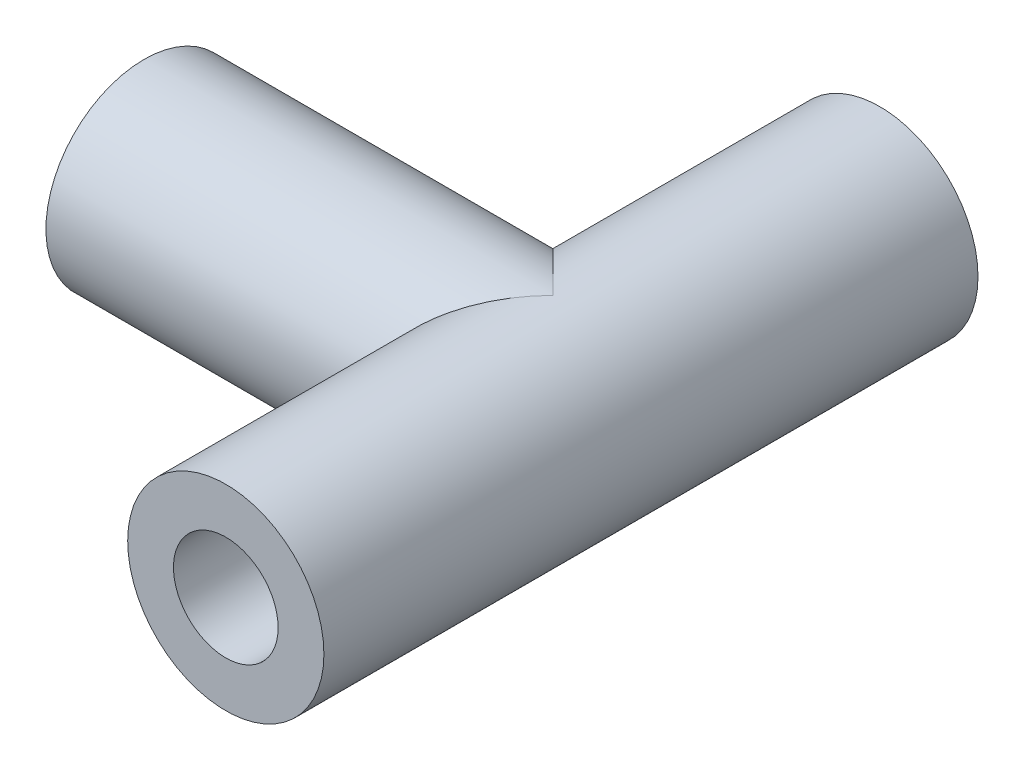
ISO-10303-21;
HEADER;
FILE_DESCRIPTION(('STEP AP214'),'2;1');
FILE_NAME('part.step','',(''),(''),'','','');
FILE_SCHEMA(('AUTOMOTIVE_DESIGN { 1 0 10303 214 1 1 1 1 }'));
ENDSEC;
DATA;
#1=APPLICATION_CONTEXT('core data for automotive mechanical design processes');
#2=APPLICATION_PROTOCOL_DEFINITION('international standard','automotive_design',2000,#1);
#3=PRODUCT_CONTEXT('',#1,'mechanical');
#4=PRODUCT('Part','Part','',(#3));
#5=PRODUCT_RELATED_PRODUCT_CATEGORY('part','',(#4));
#6=PRODUCT_DEFINITION_FORMATION('','',#4);
#7=PRODUCT_DEFINITION_CONTEXT('part definition',#1,'design');
#8=PRODUCT_DEFINITION('design','',#6,#7);
#9=PRODUCT_DEFINITION_SHAPE('','',#8);
#10=(LENGTH_UNIT() NAMED_UNIT(*) SI_UNIT(.MILLI.,.METRE.));
#11=(NAMED_UNIT(*) PLANE_ANGLE_UNIT() SI_UNIT($,.RADIAN.));
#12=(NAMED_UNIT(*) SI_UNIT($,.STERADIAN.) SOLID_ANGLE_UNIT());
#13=UNCERTAINTY_MEASURE_WITH_UNIT(LENGTH_MEASURE(1.E-05),#10,'distance_accuracy_value','');
#14=(GEOMETRIC_REPRESENTATION_CONTEXT(3) GLOBAL_UNCERTAINTY_ASSIGNED_CONTEXT((#13)) GLOBAL_UNIT_ASSIGNED_CONTEXT((#10,
#11,#12)) REPRESENTATION_CONTEXT('',''));
#15=CARTESIAN_POINT('',(0.,0.,0.));
#16=DIRECTION('',(0.,0.,1.));
#17=DIRECTION('',(1.,0.,0.));
#18=AXIS2_PLACEMENT_3D('',#15,#16,#17);
#19=CARTESIAN_POINT('',(0.,0.,0.));
#20=DIRECTION('',(-1.,0.,0.));
#21=DIRECTION('',(0.,0.,1.));
#22=AXIS2_PLACEMENT_3D('',#19,#20,#21);
#23=CYLINDRICAL_SURFACE('',#22,6.);
#24=CARTESIAN_POINT('',(0.,0.,0.));
#25=DIRECTION('',(-0.707106781186547,0.,-0.707106781186547));
#26=DIRECTION('',(-0.707106781186547,0.,0.707106781186547));
#27=AXIS2_PLACEMENT_3D('',#24,#25,#26);
#28=ELLIPSE('',#27,8.48528137423857,6.);
#29=CARTESIAN_POINT('',(0.,6.,0.));
#30=VERTEX_POINT('',#29);
#31=CARTESIAN_POINT('',(0.,-6.,0.));
#32=VERTEX_POINT('',#31);
#33=EDGE_CURVE('E11',#30,#32,#28,.F.);
#34=ORIENTED_EDGE('',*,*,#33,.F.);
#35=CARTESIAN_POINT('',(0.,0.,0.));
#36=DIRECTION('',(-0.707106781186547,0.,0.707106781186547));
#37=DIRECTION('',(-0.707106781186547,0.,-0.707106781186547));
#38=AXIS2_PLACEMENT_3D('',#35,#36,#37);
#39=ELLIPSE('',#38,8.48528137423857,6.);
#40=EDGE_CURVE('E52',#32,#30,#39,.F.);
#41=ORIENTED_EDGE('',*,*,#40,.F.);
#42=EDGE_LOOP('',(#34,#41));
#43=FACE_BOUND('',#42,.T.);
#44=CARTESIAN_POINT('',(-25.,0.,0.));
#45=DIRECTION('',(1.,0.,0.));
#46=DIRECTION('',(0.,0.,-1.));
#47=AXIS2_PLACEMENT_3D('',#44,#45,#46);
#48=CIRCLE('',#47,6.);
#49=CARTESIAN_POINT('',(-25.,0.,-6.));
#50=VERTEX_POINT('',#49);
#51=EDGE_CURVE('E88',#50,#50,#48,.T.);
#52=ORIENTED_EDGE('',*,*,#51,.T.);
#53=EDGE_LOOP('',(#52));
#54=FACE_BOUND('',#53,.T.);
#55=ADVANCED_FACE('F44',(#43,#54),#23,.T.);
#56=CARTESIAN_POINT('',(0.,0.,8.));
#57=DIRECTION('',(0.,0.,-1.));
#58=DIRECTION('',(-1.,0.,0.));
#59=AXIS2_PLACEMENT_3D('',#56,#57,#58);
#60=CYLINDRICAL_SURFACE('',#59,6.);
#61=ORIENTED_EDGE('',*,*,#40,.T.);
#62=ORIENTED_EDGE('',*,*,#33,.T.);
#63=EDGE_LOOP('',(#61,#62));
#64=FACE_BOUND('',#63,.T.);
#65=CARTESIAN_POINT('',(0.,0.,-20.));
#66=DIRECTION('',(0.,0.,1.));
#67=DIRECTION('',(1.,0.,0.));
#68=AXIS2_PLACEMENT_3D('',#65,#66,#67);
#69=CIRCLE('',#68,6.);
#70=CARTESIAN_POINT('',(6.,0.,-20.));
#71=VERTEX_POINT('',#70);
#72=EDGE_CURVE('E64',#71,#71,#69,.T.);
#73=ORIENTED_EDGE('',*,*,#72,.T.);
#74=EDGE_LOOP('',(#73));
#75=FACE_BOUND('',#74,.T.);
#76=CARTESIAN_POINT('',(0.,0.,20.));
#77=DIRECTION('',(0.,0.,1.));
#78=DIRECTION('',(1.,0.,0.));
#79=AXIS2_PLACEMENT_3D('',#76,#77,#78);
#80=CIRCLE('',#79,6.);
#81=CARTESIAN_POINT('',(6.,0.,20.));
#82=VERTEX_POINT('',#81);
#83=EDGE_CURVE('E74',#82,#82,#80,.T.);
#84=ORIENTED_EDGE('',*,*,#83,.F.);
#85=EDGE_LOOP('',(#84));
#86=FACE_BOUND('',#85,.T.);
#87=ADVANCED_FACE('F63',(#64,#75,#86),#60,.T.);
#88=CARTESIAN_POINT('',(0.,0.,-20.));
#89=DIRECTION('',(0.,0.,1.));
#90=DIRECTION('',(1.,0.,0.));
#91=AXIS2_PLACEMENT_3D('',#88,#89,#90);
#92=PLANE('',#91);
#93=CARTESIAN_POINT('',(0.,0.,-20.));
#94=DIRECTION('',(0.,0.,1.));
#95=DIRECTION('',(1.,0.,0.));
#96=AXIS2_PLACEMENT_3D('',#93,#94,#95);
#97=CIRCLE('',#96,3.2);
#98=CARTESIAN_POINT('',(3.2,0.,-20.));
#99=VERTEX_POINT('',#98);
#100=EDGE_CURVE('E68',#99,#99,#97,.T.);
#101=ORIENTED_EDGE('',*,*,#100,.T.);
#102=EDGE_LOOP('',(#101));
#103=FACE_BOUND('',#102,.T.);
#104=ORIENTED_EDGE('',*,*,#72,.F.);
#105=EDGE_LOOP('',(#104));
#106=FACE_BOUND('',#105,.T.);
#107=ADVANCED_FACE('F119',(#103,#106),#92,.F.);
#108=CARTESIAN_POINT('',(0.,0.,-10.));
#109=DIRECTION('',(0.,0.,-1.));
#110=DIRECTION('',(-1.,0.,0.));
#111=AXIS2_PLACEMENT_3D('',#108,#109,#110);
#112=CYLINDRICAL_SURFACE('',#111,3.2);
#113=CARTESIAN_POINT('',(0.,0.,-10.));
#114=DIRECTION('',(0.,0.,1.));
#115=DIRECTION('',(1.,0.,0.));
#116=AXIS2_PLACEMENT_3D('',#113,#114,#115);
#117=CIRCLE('',#116,3.2);
#118=CARTESIAN_POINT('',(3.2,0.,-10.));
#119=VERTEX_POINT('',#118);
#120=EDGE_CURVE('E70',#119,#119,#117,.T.);
#121=ORIENTED_EDGE('',*,*,#120,.T.);
#122=EDGE_LOOP('',(#121));
#123=FACE_BOUND('',#122,.T.);
#124=ORIENTED_EDGE('',*,*,#100,.F.);
#125=EDGE_LOOP('',(#124));
#126=FACE_BOUND('',#125,.T.);
#127=ADVANCED_FACE('F124',(#123,#126),#112,.F.);
#128=CARTESIAN_POINT('',(0.,0.,-10.));
#129=DIRECTION('',(0.,0.,1.));
#130=DIRECTION('',(1.,0.,0.));
#131=AXIS2_PLACEMENT_3D('',#128,#129,#130);
#132=PLANE('',#131);
#133=ORIENTED_EDGE('',*,*,#120,.F.);
#134=EDGE_LOOP('',(#133));
#135=FACE_BOUND('',#134,.T.);
#136=ADVANCED_FACE('F129',(#135),#132,.F.);
#137=CARTESIAN_POINT('',(0.,0.,20.));
#138=DIRECTION('',(0.,0.,1.));
#139=DIRECTION('',(1.,0.,0.));
#140=AXIS2_PLACEMENT_3D('',#137,#138,#139);
#141=PLANE('',#140);
#142=CARTESIAN_POINT('',(0.,0.,20.));
#143=DIRECTION('',(0.,0.,1.));
#144=DIRECTION('',(1.,0.,0.));
#145=AXIS2_PLACEMENT_3D('',#142,#143,#144);
#146=CIRCLE('',#145,3.2);
#147=CARTESIAN_POINT('',(3.2,0.,20.));
#148=VERTEX_POINT('',#147);
#149=EDGE_CURVE('E85',#148,#148,#146,.T.);
#150=ORIENTED_EDGE('',*,*,#149,.F.);
#151=EDGE_LOOP('',(#150));
#152=FACE_BOUND('',#151,.T.);
#153=ORIENTED_EDGE('',*,*,#83,.T.);
#154=EDGE_LOOP('',(#153));
#155=FACE_BOUND('',#154,.T.);
#156=ADVANCED_FACE('F131',(#152,#155),#141,.T.);
#157=CARTESIAN_POINT('',(0.,0.,10.));
#158=DIRECTION('',(0.,0.,1.));
#159=DIRECTION('',(1.,0.,0.));
#160=AXIS2_PLACEMENT_3D('',#157,#158,#159);
#161=CYLINDRICAL_SURFACE('',#160,3.2);
#162=CARTESIAN_POINT('',(0.,0.,10.));
#163=DIRECTION('',(0.,0.,1.));
#164=DIRECTION('',(1.,0.,0.));
#165=AXIS2_PLACEMENT_3D('',#162,#163,#164);
#166=CIRCLE('',#165,3.2);
#167=CARTESIAN_POINT('',(3.2,0.,10.));
#168=VERTEX_POINT('',#167);
#169=EDGE_CURVE('E82',#168,#168,#166,.T.);
#170=ORIENTED_EDGE('',*,*,#169,.F.);
#171=EDGE_LOOP('',(#170));
#172=FACE_BOUND('',#171,.T.);
#173=ORIENTED_EDGE('',*,*,#149,.T.);
#174=EDGE_LOOP('',(#173));
#175=FACE_BOUND('',#174,.T.);
#176=ADVANCED_FACE('F140',(#172,#175),#161,.F.);
#177=CARTESIAN_POINT('',(0.,0.,10.));
#178=DIRECTION('',(0.,0.,1.));
#179=DIRECTION('',(1.,0.,0.));
#180=AXIS2_PLACEMENT_3D('',#177,#178,#179);
#181=PLANE('',#180);
#182=ORIENTED_EDGE('',*,*,#169,.T.);
#183=EDGE_LOOP('',(#182));
#184=FACE_BOUND('',#183,.T.);
#185=ADVANCED_FACE('F143',(#184),#181,.T.);
#186=CARTESIAN_POINT('',(-25.,0.,0.));
#187=DIRECTION('',(1.,0.,0.));
#188=DIRECTION('',(0.,0.,-1.));
#189=AXIS2_PLACEMENT_3D('',#186,#187,#188);
#190=PLANE('',#189);
#191=CARTESIAN_POINT('',(-25.,0.,0.));
#192=DIRECTION('',(1.,0.,0.));
#193=DIRECTION('',(0.,0.,-1.));
#194=AXIS2_PLACEMENT_3D('',#191,#192,#193);
#195=CIRCLE('',#194,3.2);
#196=CARTESIAN_POINT('',(-25.,0.,-3.2));
#197=VERTEX_POINT('',#196);
#198=EDGE_CURVE('E94',#197,#197,#195,.T.);
#199=ORIENTED_EDGE('',*,*,#198,.T.);
#200=EDGE_LOOP('',(#199));
#201=FACE_BOUND('',#200,.T.);
#202=ORIENTED_EDGE('',*,*,#51,.F.);
#203=EDGE_LOOP('',(#202));
#204=FACE_BOUND('',#203,.T.);
#205=ADVANCED_FACE('F112',(#201,#204),#190,.F.);
#206=CARTESIAN_POINT('',(-15.,0.,0.));
#207=DIRECTION('',(-1.,0.,0.));
#208=DIRECTION('',(0.,0.,1.));
#209=AXIS2_PLACEMENT_3D('',#206,#207,#208);
#210=CYLINDRICAL_SURFACE('',#209,3.2);
#211=CARTESIAN_POINT('',(-15.,0.,0.));
#212=DIRECTION('',(1.,0.,0.));
#213=DIRECTION('',(0.,0.,-1.));
#214=AXIS2_PLACEMENT_3D('',#211,#212,#213);
#215=CIRCLE('',#214,3.2);
#216=CARTESIAN_POINT('',(-15.,0.,-3.2));
#217=VERTEX_POINT('',#216);
#218=EDGE_CURVE('E91',#217,#217,#215,.T.);
#219=ORIENTED_EDGE('',*,*,#218,.T.);
#220=EDGE_LOOP('',(#219));
#221=FACE_BOUND('',#220,.T.);
#222=ORIENTED_EDGE('',*,*,#198,.F.);
#223=EDGE_LOOP('',(#222));
#224=FACE_BOUND('',#223,.T.);
#225=ADVANCED_FACE('F105',(#221,#224),#210,.F.);
#226=CARTESIAN_POINT('',(-15.,0.,0.));
#227=DIRECTION('',(1.,0.,0.));
#228=DIRECTION('',(0.,0.,-1.));
#229=AXIS2_PLACEMENT_3D('',#226,#227,#228);
#230=PLANE('',#229);
#231=ORIENTED_EDGE('',*,*,#218,.F.);
#232=EDGE_LOOP('',(#231));
#233=FACE_BOUND('',#232,.T.);
#234=ADVANCED_FACE('F104',(#233),#230,.F.);
#235=CLOSED_SHELL('',(#55,#87,#107,#127,#136,#156,#176,#185,#205,#225,#234));
#236=MANIFOLD_SOLID_BREP('B2',#235);
#237=ADVANCED_BREP_SHAPE_REPRESENTATION('',(#18,#236),#14);
#238=SHAPE_DEFINITION_REPRESENTATION(#9,#237);
ENDSEC;
END-ISO-10303-21;
